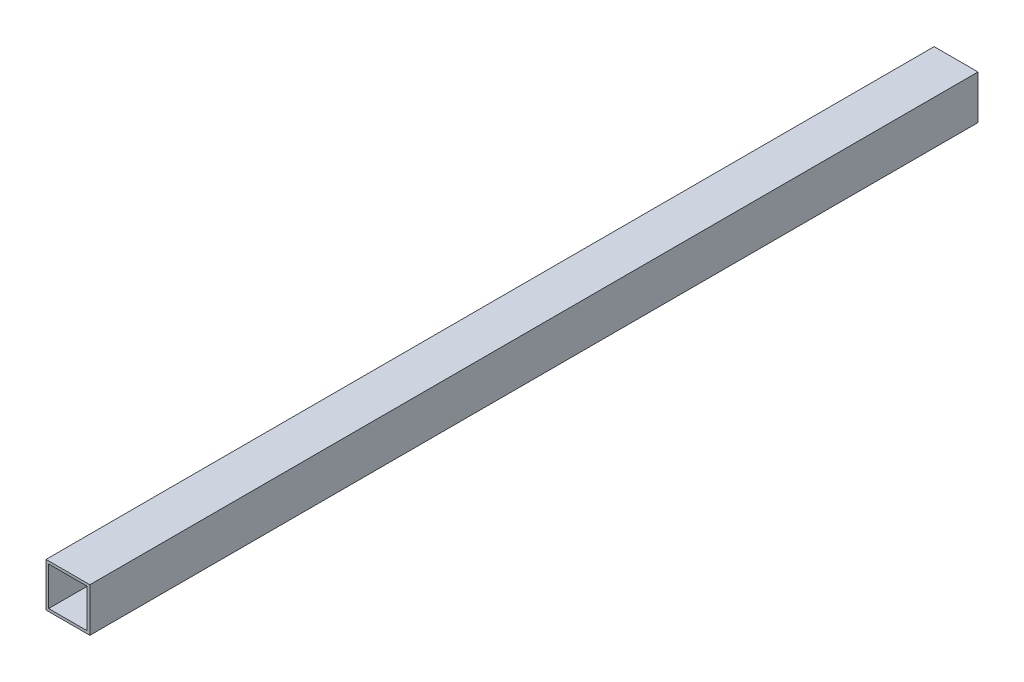
ISO-10303-21;
HEADER;
FILE_DESCRIPTION(('STEP AP214'),'2;1');
FILE_NAME('part.step','',(''),(''),'','','');
FILE_SCHEMA(('AUTOMOTIVE_DESIGN { 1 0 10303 214 1 1 1 1 }'));
ENDSEC;
DATA;
#1=APPLICATION_CONTEXT('core data for automotive mechanical design processes');
#2=APPLICATION_PROTOCOL_DEFINITION('international standard','automotive_design',2000,#1);
#3=PRODUCT_CONTEXT('',#1,'mechanical');
#4=PRODUCT('Part','Part','',(#3));
#5=PRODUCT_RELATED_PRODUCT_CATEGORY('part','',(#4));
#6=PRODUCT_DEFINITION_FORMATION('','',#4);
#7=PRODUCT_DEFINITION_CONTEXT('part definition',#1,'design');
#8=PRODUCT_DEFINITION('design','',#6,#7);
#9=PRODUCT_DEFINITION_SHAPE('','',#8);
#10=(LENGTH_UNIT() NAMED_UNIT(*) SI_UNIT(.MILLI.,.METRE.));
#11=(NAMED_UNIT(*) PLANE_ANGLE_UNIT() SI_UNIT($,.RADIAN.));
#12=(NAMED_UNIT(*) SI_UNIT($,.STERADIAN.) SOLID_ANGLE_UNIT());
#13=UNCERTAINTY_MEASURE_WITH_UNIT(LENGTH_MEASURE(1.E-05),#10,'distance_accuracy_value','');
#14=(GEOMETRIC_REPRESENTATION_CONTEXT(3) GLOBAL_UNCERTAINTY_ASSIGNED_CONTEXT((#13)) GLOBAL_UNIT_ASSIGNED_CONTEXT((#10,
#11,#12)) REPRESENTATION_CONTEXT('',''));
#15=CARTESIAN_POINT('',(0.,0.,0.));
#16=DIRECTION('',(0.,0.,1.));
#17=DIRECTION('',(1.,0.,0.));
#18=AXIS2_PLACEMENT_3D('',#15,#16,#17);
#19=CARTESIAN_POINT('',(0.,0.,514.35));
#20=DIRECTION('',(0.,0.,1.));
#21=DIRECTION('',(1.,0.,0.));
#22=AXIS2_PLACEMENT_3D('',#19,#20,#21);
#23=PLANE('',#22);
#24=DIRECTION('',(0.,-1.,0.));
#25=VECTOR('',#24,1.);
#26=CARTESIAN_POINT('',(0.,0.,514.35));
#27=LINE('',#26,#25);
#28=CARTESIAN_POINT('',(0.,25.4,514.35));
#29=VERTEX_POINT('',#28);
#30=CARTESIAN_POINT('',(0.,0.,514.35));
#31=VERTEX_POINT('',#30);
#32=EDGE_CURVE('E161',#29,#31,#27,.T.);
#33=ORIENTED_EDGE('',*,*,#32,.T.);
#34=DIRECTION('',(1.,0.,0.));
#35=VECTOR('',#34,1.);
#36=CARTESIAN_POINT('',(0.,0.,514.35));
#37=LINE('',#36,#35);
#38=CARTESIAN_POINT('',(25.4,0.,514.35));
#39=VERTEX_POINT('',#38);
#40=EDGE_CURVE('E164',#31,#39,#37,.T.);
#41=ORIENTED_EDGE('',*,*,#40,.T.);
#42=DIRECTION('',(0.,1.,0.));
#43=VECTOR('',#42,1.);
#44=CARTESIAN_POINT('',(25.4,0.,514.35));
#45=LINE('',#44,#43);
#46=CARTESIAN_POINT('',(25.4,25.4,514.35));
#47=VERTEX_POINT('',#46);
#48=EDGE_CURVE('E167',#39,#47,#45,.T.);
#49=ORIENTED_EDGE('',*,*,#48,.T.);
#50=DIRECTION('',(-1.,0.,0.));
#51=VECTOR('',#50,1.);
#52=CARTESIAN_POINT('',(0.,25.4,514.35));
#53=LINE('',#52,#51);
#54=EDGE_CURVE('E169',#47,#29,#53,.T.);
#55=ORIENTED_EDGE('',*,*,#54,.T.);
#56=EDGE_LOOP('',(#33,#41,#49,#55));
#57=FACE_BOUND('',#56,.T.);
#58=DIRECTION('',(1.,0.,0.));
#59=VECTOR('',#58,1.);
#60=CARTESIAN_POINT('',(0.,1.524,514.35));
#61=LINE('',#60,#59);
#62=CARTESIAN_POINT('',(1.524,1.524,514.35));
#63=VERTEX_POINT('',#62);
#64=CARTESIAN_POINT('',(23.876,1.524,514.35));
#65=VERTEX_POINT('',#64);
#66=EDGE_CURVE('E133',#63,#65,#61,.T.);
#67=ORIENTED_EDGE('',*,*,#66,.F.);
#68=DIRECTION('',(0.,-1.,0.));
#69=VECTOR('',#68,1.);
#70=CARTESIAN_POINT('',(1.524,0.,514.35));
#71=LINE('',#70,#69);
#72=CARTESIAN_POINT('',(1.52399999999999,23.876,514.35));
#73=VERTEX_POINT('',#72);
#74=EDGE_CURVE('E125',#73,#63,#71,.T.);
#75=ORIENTED_EDGE('',*,*,#74,.F.);
#76=DIRECTION('',(-1.,0.,0.));
#77=VECTOR('',#76,1.);
#78=CARTESIAN_POINT('',(0.,23.876,514.35));
#79=LINE('',#78,#77);
#80=CARTESIAN_POINT('',(23.876,23.876,514.35));
#81=VERTEX_POINT('',#80);
#82=EDGE_CURVE('E147',#81,#73,#79,.T.);
#83=ORIENTED_EDGE('',*,*,#82,.F.);
#84=DIRECTION('',(0.,1.,0.));
#85=VECTOR('',#84,1.);
#86=CARTESIAN_POINT('',(23.876,0.,514.35));
#87=LINE('',#86,#85);
#88=EDGE_CURVE('E145',#65,#81,#87,.T.);
#89=ORIENTED_EDGE('',*,*,#88,.F.);
#90=EDGE_LOOP('',(#67,#75,#83,#89));
#91=FACE_BOUND('',#90,.T.);
#92=ADVANCED_FACE('F60',(#57,#91),#23,.T.);
#93=CARTESIAN_POINT('',(0.,0.,0.));
#94=DIRECTION('',(0.,0.,1.));
#95=DIRECTION('',(1.,0.,0.));
#96=AXIS2_PLACEMENT_3D('',#93,#94,#95);
#97=PLANE('',#96);
#98=DIRECTION('',(0.,-1.,0.));
#99=VECTOR('',#98,1.);
#100=CARTESIAN_POINT('',(0.,0.,0.));
#101=LINE('',#100,#99);
#102=CARTESIAN_POINT('',(0.,25.4,0.));
#103=VERTEX_POINT('',#102);
#104=CARTESIAN_POINT('',(0.,0.,0.));
#105=VERTEX_POINT('',#104);
#106=EDGE_CURVE('E141',#103,#105,#101,.T.);
#107=ORIENTED_EDGE('',*,*,#106,.F.);
#108=DIRECTION('',(-1.,0.,0.));
#109=VECTOR('',#108,1.);
#110=CARTESIAN_POINT('',(0.,25.4,0.));
#111=LINE('',#110,#109);
#112=CARTESIAN_POINT('',(25.4,25.4,0.));
#113=VERTEX_POINT('',#112);
#114=EDGE_CURVE('E165',#113,#103,#111,.T.);
#115=ORIENTED_EDGE('',*,*,#114,.F.);
#116=DIRECTION('',(0.,1.,0.));
#117=VECTOR('',#116,1.);
#118=CARTESIAN_POINT('',(25.4,0.,0.));
#119=LINE('',#118,#117);
#120=CARTESIAN_POINT('',(25.4,0.,0.));
#121=VERTEX_POINT('',#120);
#122=EDGE_CURVE('E176',#121,#113,#119,.T.);
#123=ORIENTED_EDGE('',*,*,#122,.F.);
#124=DIRECTION('',(1.,0.,0.));
#125=VECTOR('',#124,1.);
#126=CARTESIAN_POINT('',(0.,0.,0.));
#127=LINE('',#126,#125);
#128=EDGE_CURVE('E174',#105,#121,#127,.T.);
#129=ORIENTED_EDGE('',*,*,#128,.F.);
#130=EDGE_LOOP('',(#107,#115,#123,#129));
#131=FACE_BOUND('',#130,.T.);
#132=DIRECTION('',(0.,-1.,0.));
#133=VECTOR('',#132,1.);
#134=CARTESIAN_POINT('',(1.524,0.,0.));
#135=LINE('',#134,#133);
#136=CARTESIAN_POINT('',(1.52399999999999,23.876,0.));
#137=VERTEX_POINT('',#136);
#138=CARTESIAN_POINT('',(1.524,1.524,0.));
#139=VERTEX_POINT('',#138);
#140=EDGE_CURVE('E83',#137,#139,#135,.T.);
#141=ORIENTED_EDGE('',*,*,#140,.T.);
#142=DIRECTION('',(1.,0.,0.));
#143=VECTOR('',#142,1.);
#144=CARTESIAN_POINT('',(0.,1.524,0.));
#145=LINE('',#144,#143);
#146=CARTESIAN_POINT('',(23.876,1.524,0.));
#147=VERTEX_POINT('',#146);
#148=EDGE_CURVE('E140',#139,#147,#145,.T.);
#149=ORIENTED_EDGE('',*,*,#148,.T.);
#150=DIRECTION('',(0.,1.,0.));
#151=VECTOR('',#150,1.);
#152=CARTESIAN_POINT('',(23.876,0.,0.));
#153=LINE('',#152,#151);
#154=CARTESIAN_POINT('',(23.876,23.876,0.));
#155=VERTEX_POINT('',#154);
#156=EDGE_CURVE('E153',#147,#155,#153,.T.);
#157=ORIENTED_EDGE('',*,*,#156,.T.);
#158=DIRECTION('',(-1.,0.,0.));
#159=VECTOR('',#158,1.);
#160=CARTESIAN_POINT('',(0.,23.876,0.));
#161=LINE('',#160,#159);
#162=EDGE_CURVE('E134',#155,#137,#161,.T.);
#163=ORIENTED_EDGE('',*,*,#162,.T.);
#164=EDGE_LOOP('',(#141,#149,#157,#163));
#165=FACE_BOUND('',#164,.T.);
#166=ADVANCED_FACE('F194',(#131,#165),#97,.F.);
#167=CARTESIAN_POINT('',(0.,0.,514.35));
#168=DIRECTION('',(1.,0.,0.));
#169=DIRECTION('',(0.,1.,0.));
#170=AXIS2_PLACEMENT_3D('',#167,#168,#169);
#171=PLANE('',#170);
#172=ORIENTED_EDGE('',*,*,#106,.T.);
#173=DIRECTION('',(0.,0.,-1.));
#174=VECTOR('',#173,1.);
#175=CARTESIAN_POINT('',(0.,0.,514.35));
#176=LINE('',#175,#174);
#177=EDGE_CURVE('E12',#31,#105,#176,.T.);
#178=ORIENTED_EDGE('',*,*,#177,.F.);
#179=ORIENTED_EDGE('',*,*,#32,.F.);
#180=DIRECTION('',(0.,0.,-1.));
#181=VECTOR('',#180,1.);
#182=CARTESIAN_POINT('',(0.,25.4,514.35));
#183=LINE('',#182,#181);
#184=EDGE_CURVE('E171',#29,#103,#183,.T.);
#185=ORIENTED_EDGE('',*,*,#184,.T.);
#186=EDGE_LOOP('',(#172,#178,#179,#185));
#187=FACE_BOUND('',#186,.T.);
#188=ADVANCED_FACE('F62',(#187),#171,.F.);
#189=CARTESIAN_POINT('',(0.,0.,514.35));
#190=DIRECTION('',(0.,1.,0.));
#191=DIRECTION('',(0.,0.,1.));
#192=AXIS2_PLACEMENT_3D('',#189,#190,#191);
#193=PLANE('',#192);
#194=ORIENTED_EDGE('',*,*,#128,.T.);
#195=DIRECTION('',(0.,0.,-1.));
#196=VECTOR('',#195,1.);
#197=CARTESIAN_POINT('',(25.4,0.,514.35));
#198=LINE('',#197,#196);
#199=EDGE_CURVE('E68',#39,#121,#198,.T.);
#200=ORIENTED_EDGE('',*,*,#199,.F.);
#201=ORIENTED_EDGE('',*,*,#40,.F.);
#202=ORIENTED_EDGE('',*,*,#177,.T.);
#203=EDGE_LOOP('',(#194,#200,#201,#202));
#204=FACE_BOUND('',#203,.T.);
#205=ADVANCED_FACE('F204',(#204),#193,.F.);
#206=CARTESIAN_POINT('',(25.4,0.,514.35));
#207=DIRECTION('',(-1.,0.,0.));
#208=DIRECTION('',(0.,-1.,0.));
#209=AXIS2_PLACEMENT_3D('',#206,#207,#208);
#210=PLANE('',#209);
#211=ORIENTED_EDGE('',*,*,#122,.T.);
#212=DIRECTION('',(0.,0.,-1.));
#213=VECTOR('',#212,1.);
#214=CARTESIAN_POINT('',(25.4,25.4,514.35));
#215=LINE('',#214,#213);
#216=EDGE_CURVE('E181',#47,#113,#215,.T.);
#217=ORIENTED_EDGE('',*,*,#216,.F.);
#218=ORIENTED_EDGE('',*,*,#48,.F.);
#219=ORIENTED_EDGE('',*,*,#199,.T.);
#220=EDGE_LOOP('',(#211,#217,#218,#219));
#221=FACE_BOUND('',#220,.T.);
#222=ADVANCED_FACE('F188',(#221),#210,.F.);
#223=CARTESIAN_POINT('',(0.,25.4,514.35));
#224=DIRECTION('',(0.,-1.,0.));
#225=DIRECTION('',(0.,0.,-1.));
#226=AXIS2_PLACEMENT_3D('',#223,#224,#225);
#227=PLANE('',#226);
#228=ORIENTED_EDGE('',*,*,#114,.T.);
#229=ORIENTED_EDGE('',*,*,#184,.F.);
#230=ORIENTED_EDGE('',*,*,#54,.F.);
#231=ORIENTED_EDGE('',*,*,#216,.T.);
#232=EDGE_LOOP('',(#228,#229,#230,#231));
#233=FACE_BOUND('',#232,.T.);
#234=ADVANCED_FACE('F198',(#233),#227,.F.);
#235=CARTESIAN_POINT('',(1.524,0.,514.35));
#236=DIRECTION('',(1.,0.,0.));
#237=DIRECTION('',(0.,1.,0.));
#238=AXIS2_PLACEMENT_3D('',#235,#236,#237);
#239=PLANE('',#238);
#240=ORIENTED_EDGE('',*,*,#140,.F.);
#241=DIRECTION('',(0.,0.,-1.));
#242=VECTOR('',#241,1.);
#243=CARTESIAN_POINT('',(1.52399999999999,23.876,514.35));
#244=LINE('',#243,#242);
#245=EDGE_CURVE('E129',#73,#137,#244,.T.);
#246=ORIENTED_EDGE('',*,*,#245,.F.);
#247=ORIENTED_EDGE('',*,*,#74,.T.);
#248=DIRECTION('',(0.,0.,-1.));
#249=VECTOR('',#248,1.);
#250=CARTESIAN_POINT('',(1.524,1.524,514.35));
#251=LINE('',#250,#249);
#252=EDGE_CURVE('E128',#63,#139,#251,.T.);
#253=ORIENTED_EDGE('',*,*,#252,.T.);
#254=EDGE_LOOP('',(#240,#246,#247,#253));
#255=FACE_BOUND('',#254,.T.);
#256=ADVANCED_FACE('F127',(#255),#239,.T.);
#257=CARTESIAN_POINT('',(0.,1.524,514.35));
#258=DIRECTION('',(0.,1.,0.));
#259=DIRECTION('',(0.,0.,1.));
#260=AXIS2_PLACEMENT_3D('',#257,#258,#259);
#261=PLANE('',#260);
#262=ORIENTED_EDGE('',*,*,#148,.F.);
#263=ORIENTED_EDGE('',*,*,#252,.F.);
#264=ORIENTED_EDGE('',*,*,#66,.T.);
#265=DIRECTION('',(0.,0.,-1.));
#266=VECTOR('',#265,1.);
#267=CARTESIAN_POINT('',(23.876,1.524,514.35));
#268=LINE('',#267,#266);
#269=EDGE_CURVE('E142',#65,#147,#268,.T.);
#270=ORIENTED_EDGE('',*,*,#269,.T.);
#271=EDGE_LOOP('',(#262,#263,#264,#270));
#272=FACE_BOUND('',#271,.T.);
#273=ADVANCED_FACE('F137',(#272),#261,.T.);
#274=CARTESIAN_POINT('',(23.876,0.,514.35));
#275=DIRECTION('',(-1.,0.,0.));
#276=DIRECTION('',(0.,-1.,0.));
#277=AXIS2_PLACEMENT_3D('',#274,#275,#276);
#278=PLANE('',#277);
#279=ORIENTED_EDGE('',*,*,#156,.F.);
#280=ORIENTED_EDGE('',*,*,#269,.F.);
#281=ORIENTED_EDGE('',*,*,#88,.T.);
#282=DIRECTION('',(0.,0.,-1.));
#283=VECTOR('',#282,1.);
#284=CARTESIAN_POINT('',(23.876,23.876,514.35));
#285=LINE('',#284,#283);
#286=EDGE_CURVE('E75',#81,#155,#285,.T.);
#287=ORIENTED_EDGE('',*,*,#286,.T.);
#288=EDGE_LOOP('',(#279,#280,#281,#287));
#289=FACE_BOUND('',#288,.T.);
#290=ADVANCED_FACE('F227',(#289),#278,.T.);
#291=CARTESIAN_POINT('',(0.,23.876,514.35));
#292=DIRECTION('',(0.,-1.,0.));
#293=DIRECTION('',(0.,0.,-1.));
#294=AXIS2_PLACEMENT_3D('',#291,#292,#293);
#295=PLANE('',#294);
#296=ORIENTED_EDGE('',*,*,#162,.F.);
#297=ORIENTED_EDGE('',*,*,#286,.F.);
#298=ORIENTED_EDGE('',*,*,#82,.T.);
#299=ORIENTED_EDGE('',*,*,#245,.T.);
#300=EDGE_LOOP('',(#296,#297,#298,#299));
#301=FACE_BOUND('',#300,.T.);
#302=ADVANCED_FACE('F231',(#301),#295,.T.);
#303=CLOSED_SHELL('',(#92,#166,#188,#205,#222,#234,#256,#273,#290,#302));
#304=MANIFOLD_SOLID_BREP('B2',#303);
#305=ADVANCED_BREP_SHAPE_REPRESENTATION('',(#18,#304),#14);
#306=SHAPE_DEFINITION_REPRESENTATION(#9,#305);
ENDSEC;
END-ISO-10303-21;
